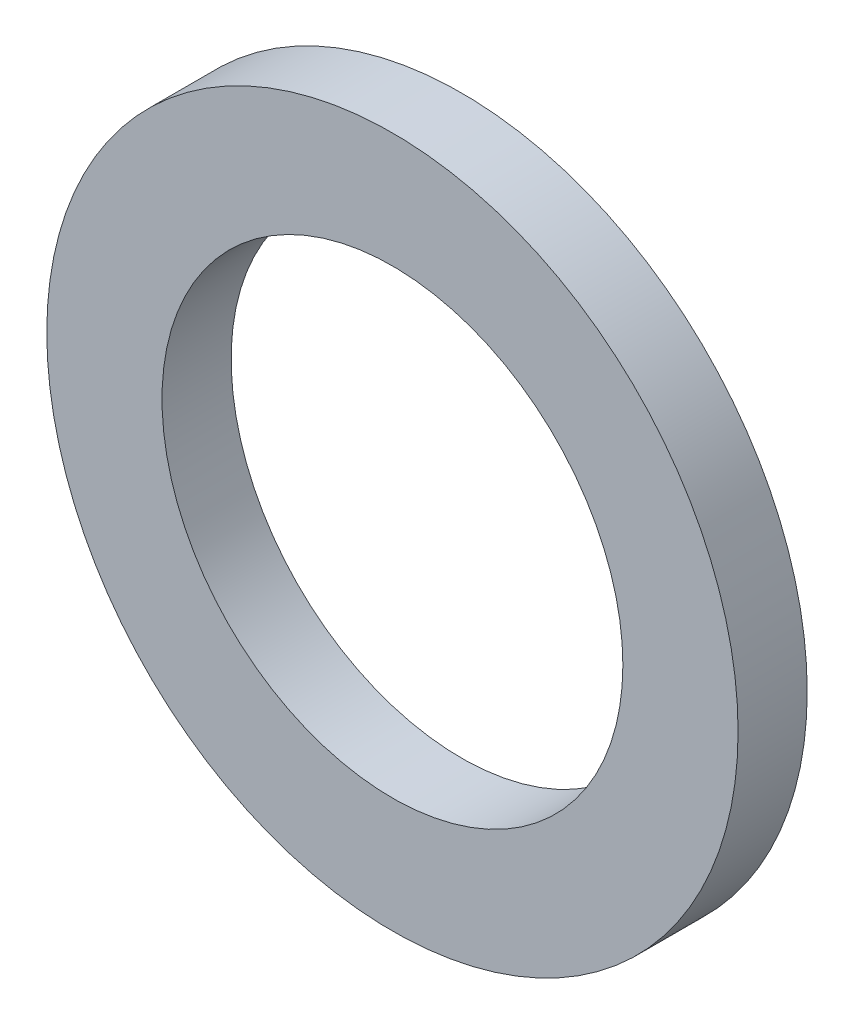
ISO-10303-21;
HEADER;
FILE_DESCRIPTION(('STEP AP214'),'2;1');
FILE_NAME('part.step','',(''),(''),'','','');
FILE_SCHEMA(('AUTOMOTIVE_DESIGN { 1 0 10303 214 1 1 1 1 }'));
ENDSEC;
DATA;
#1=APPLICATION_CONTEXT('core data for automotive mechanical design processes');
#2=APPLICATION_PROTOCOL_DEFINITION('international standard','automotive_design',2000,#1);
#3=PRODUCT_CONTEXT('',#1,'mechanical');
#4=PRODUCT('Part','Part','',(#3));
#5=PRODUCT_RELATED_PRODUCT_CATEGORY('part','',(#4));
#6=PRODUCT_DEFINITION_FORMATION('','',#4);
#7=PRODUCT_DEFINITION_CONTEXT('part definition',#1,'design');
#8=PRODUCT_DEFINITION('design','',#6,#7);
#9=PRODUCT_DEFINITION_SHAPE('','',#8);
#10=(LENGTH_UNIT() NAMED_UNIT(*) SI_UNIT(.MILLI.,.METRE.));
#11=(NAMED_UNIT(*) PLANE_ANGLE_UNIT() SI_UNIT($,.RADIAN.));
#12=(NAMED_UNIT(*) SI_UNIT($,.STERADIAN.) SOLID_ANGLE_UNIT());
#13=UNCERTAINTY_MEASURE_WITH_UNIT(LENGTH_MEASURE(1.E-05),#10,'distance_accuracy_value','');
#14=(GEOMETRIC_REPRESENTATION_CONTEXT(3) GLOBAL_UNCERTAINTY_ASSIGNED_CONTEXT((#13)) GLOBAL_UNIT_ASSIGNED_CONTEXT((#10,
#11,#12)) REPRESENTATION_CONTEXT('',''));
#15=CARTESIAN_POINT('',(0.,0.,0.));
#16=DIRECTION('',(0.,0.,1.));
#17=DIRECTION('',(1.,0.,0.));
#18=AXIS2_PLACEMENT_3D('',#15,#16,#17);
#19=CARTESIAN_POINT('',(0.,0.,1.2));
#20=DIRECTION('',(0.,0.,-1.));
#21=DIRECTION('',(-1.,0.,0.));
#22=AXIS2_PLACEMENT_3D('',#19,#20,#21);
#23=CYLINDRICAL_SURFACE('',#22,6.);
#24=CARTESIAN_POINT('',(0.,0.,1.2));
#25=DIRECTION('',(0.,0.,1.));
#26=DIRECTION('',(1.,0.,0.));
#27=AXIS2_PLACEMENT_3D('',#24,#25,#26);
#28=CIRCLE('',#27,6.);
#29=CARTESIAN_POINT('',(6.,0.,1.2));
#30=VERTEX_POINT('',#29);
#31=EDGE_CURVE('E12',#30,#30,#28,.T.);
#32=ORIENTED_EDGE('',*,*,#31,.F.);
#33=EDGE_LOOP('',(#32));
#34=FACE_BOUND('',#33,.T.);
#35=CARTESIAN_POINT('',(0.,0.,0.));
#36=DIRECTION('',(0.,0.,1.));
#37=DIRECTION('',(1.,0.,0.));
#38=AXIS2_PLACEMENT_3D('',#35,#36,#37);
#39=CIRCLE('',#38,6.);
#40=CARTESIAN_POINT('',(6.,0.,0.));
#41=VERTEX_POINT('',#40);
#42=EDGE_CURVE('E50',#41,#41,#39,.T.);
#43=ORIENTED_EDGE('',*,*,#42,.T.);
#44=EDGE_LOOP('',(#43));
#45=FACE_BOUND('',#44,.T.);
#46=ADVANCED_FACE('F47',(#34,#45),#23,.T.);
#47=CARTESIAN_POINT('',(0.,0.,1.2));
#48=DIRECTION('',(0.,0.,1.));
#49=DIRECTION('',(1.,0.,0.));
#50=AXIS2_PLACEMENT_3D('',#47,#48,#49);
#51=PLANE('',#50);
#52=CARTESIAN_POINT('',(0.,0.,1.2));
#53=DIRECTION('',(0.,0.,1.));
#54=DIRECTION('',(1.,0.,0.));
#55=AXIS2_PLACEMENT_3D('',#52,#53,#54);
#56=CIRCLE('',#55,4.);
#57=CARTESIAN_POINT('',(4.,0.,1.2));
#58=VERTEX_POINT('',#57);
#59=EDGE_CURVE('E59',#58,#58,#56,.T.);
#60=ORIENTED_EDGE('',*,*,#59,.F.);
#61=EDGE_LOOP('',(#60));
#62=FACE_BOUND('',#61,.T.);
#63=ORIENTED_EDGE('',*,*,#31,.T.);
#64=EDGE_LOOP('',(#63));
#65=FACE_BOUND('',#64,.T.);
#66=ADVANCED_FACE('F74',(#62,#65),#51,.T.);
#67=CARTESIAN_POINT('',(0.,0.,0.));
#68=DIRECTION('',(0.,0.,1.));
#69=DIRECTION('',(1.,0.,0.));
#70=AXIS2_PLACEMENT_3D('',#67,#68,#69);
#71=PLANE('',#70);
#72=CARTESIAN_POINT('',(0.,0.,0.));
#73=DIRECTION('',(0.,0.,1.));
#74=DIRECTION('',(1.,0.,0.));
#75=AXIS2_PLACEMENT_3D('',#72,#73,#74);
#76=CIRCLE('',#75,4.);
#77=CARTESIAN_POINT('',(4.,0.,0.));
#78=VERTEX_POINT('',#77);
#79=EDGE_CURVE('E57',#78,#78,#76,.T.);
#80=ORIENTED_EDGE('',*,*,#79,.T.);
#81=EDGE_LOOP('',(#80));
#82=FACE_BOUND('',#81,.T.);
#83=ORIENTED_EDGE('',*,*,#42,.F.);
#84=EDGE_LOOP('',(#83));
#85=FACE_BOUND('',#84,.T.);
#86=ADVANCED_FACE('F65',(#82,#85),#71,.F.);
#87=CARTESIAN_POINT('',(0.,0.,0.));
#88=DIRECTION('',(0.,0.,1.));
#89=DIRECTION('',(1.,0.,0.));
#90=AXIS2_PLACEMENT_3D('',#87,#88,#89);
#91=CYLINDRICAL_SURFACE('',#90,4.);
#92=ORIENTED_EDGE('',*,*,#79,.F.);
#93=EDGE_LOOP('',(#92));
#94=FACE_BOUND('',#93,.T.);
#95=ORIENTED_EDGE('',*,*,#59,.T.);
#96=EDGE_LOOP('',(#95));
#97=FACE_BOUND('',#96,.T.);
#98=ADVANCED_FACE('F68',(#94,#97),#91,.F.);
#99=CLOSED_SHELL('',(#46,#66,#86,#98));
#100=MANIFOLD_SOLID_BREP('B2',#99);
#101=ADVANCED_BREP_SHAPE_REPRESENTATION('',(#18,#100),#14);
#102=SHAPE_DEFINITION_REPRESENTATION(#9,#101);
ENDSEC;
END-ISO-10303-21;
